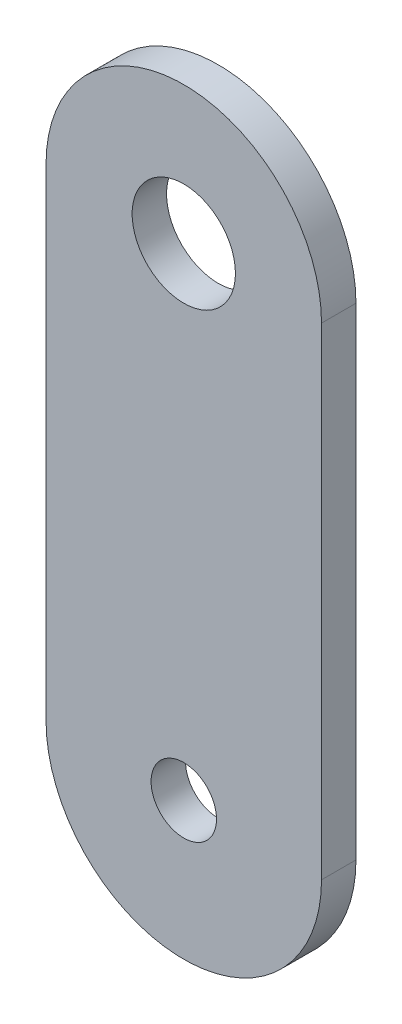
ISO-10303-21;
HEADER;
FILE_DESCRIPTION(('STEP AP214'),'2;1');
FILE_NAME('part.step','',(''),(''),'','','');
FILE_SCHEMA(('AUTOMOTIVE_DESIGN { 1 0 10303 214 1 1 1 1 }'));
ENDSEC;
DATA;
#1=APPLICATION_CONTEXT('core data for automotive mechanical design processes');
#2=APPLICATION_PROTOCOL_DEFINITION('international standard','automotive_design',2000,#1);
#3=PRODUCT_CONTEXT('',#1,'mechanical');
#4=PRODUCT('Part','Part','',(#3));
#5=PRODUCT_RELATED_PRODUCT_CATEGORY('part','',(#4));
#6=PRODUCT_DEFINITION_FORMATION('','',#4);
#7=PRODUCT_DEFINITION_CONTEXT('part definition',#1,'design');
#8=PRODUCT_DEFINITION('design','',#6,#7);
#9=PRODUCT_DEFINITION_SHAPE('','',#8);
#10=(LENGTH_UNIT() NAMED_UNIT(*) SI_UNIT(.MILLI.,.METRE.));
#11=(NAMED_UNIT(*) PLANE_ANGLE_UNIT() SI_UNIT($,.RADIAN.));
#12=(NAMED_UNIT(*) SI_UNIT($,.STERADIAN.) SOLID_ANGLE_UNIT());
#13=UNCERTAINTY_MEASURE_WITH_UNIT(LENGTH_MEASURE(1.E-05),#10,'distance_accuracy_value','');
#14=(GEOMETRIC_REPRESENTATION_CONTEXT(3) GLOBAL_UNCERTAINTY_ASSIGNED_CONTEXT((#13)) GLOBAL_UNIT_ASSIGNED_CONTEXT((#10,
#11,#12)) REPRESENTATION_CONTEXT('',''));
#15=CARTESIAN_POINT('',(0.,0.,0.));
#16=DIRECTION('',(0.,0.,1.));
#17=DIRECTION('',(1.,0.,0.));
#18=AXIS2_PLACEMENT_3D('',#15,#16,#17);
#19=CARTESIAN_POINT('',(0.,-70.,10.));
#20=DIRECTION('',(0.,0.,-1.));
#21=DIRECTION('',(-1.,0.,0.));
#22=AXIS2_PLACEMENT_3D('',#19,#20,#21);
#23=CYLINDRICAL_SURFACE('',#22,40.);
#24=CARTESIAN_POINT('',(0.,-70.,0.));
#25=DIRECTION('',(0.,0.,1.));
#26=DIRECTION('',(1.,0.,0.));
#27=AXIS2_PLACEMENT_3D('',#24,#25,#26);
#28=CIRCLE('',#27,40.);
#29=CARTESIAN_POINT('',(-40.,-70.,0.));
#30=VERTEX_POINT('',#29);
#31=CARTESIAN_POINT('',(40.,-70.,0.));
#32=VERTEX_POINT('',#31);
#33=EDGE_CURVE('E99',#30,#32,#28,.T.);
#34=ORIENTED_EDGE('',*,*,#33,.T.);
#35=DIRECTION('',(0.,0.,-1.));
#36=VECTOR('',#35,1.);
#37=CARTESIAN_POINT('',(40.,-70.,10.));
#38=LINE('',#37,#36);
#39=CARTESIAN_POINT('',(40.,-70.,10.));
#40=VERTEX_POINT('',#39);
#41=EDGE_CURVE('E11',#40,#32,#38,.T.);
#42=ORIENTED_EDGE('',*,*,#41,.F.);
#43=CARTESIAN_POINT('',(0.,-70.,10.));
#44=DIRECTION('',(0.,0.,1.));
#45=DIRECTION('',(1.,0.,0.));
#46=AXIS2_PLACEMENT_3D('',#43,#44,#45);
#47=CIRCLE('',#46,40.);
#48=CARTESIAN_POINT('',(-40.,-70.,10.));
#49=VERTEX_POINT('',#48);
#50=EDGE_CURVE('E87',#49,#40,#47,.T.);
#51=ORIENTED_EDGE('',*,*,#50,.F.);
#52=DIRECTION('',(0.,0.,-1.));
#53=VECTOR('',#52,1.);
#54=CARTESIAN_POINT('',(-40.,-70.,10.));
#55=LINE('',#54,#53);
#56=EDGE_CURVE('E95',#49,#30,#55,.T.);
#57=ORIENTED_EDGE('',*,*,#56,.T.);
#58=EDGE_LOOP('',(#34,#42,#51,#57));
#59=FACE_BOUND('',#58,.T.);
#60=ADVANCED_FACE('F36',(#59),#23,.T.);
#61=CARTESIAN_POINT('',(40.,-70.,10.));
#62=DIRECTION('',(-1.,0.,0.));
#63=DIRECTION('',(0.,-1.,0.));
#64=AXIS2_PLACEMENT_3D('',#61,#62,#63);
#65=PLANE('',#64);
#66=DIRECTION('',(0.,1.,0.));
#67=VECTOR('',#66,1.);
#68=CARTESIAN_POINT('',(40.,-70.,0.));
#69=LINE('',#68,#67);
#70=CARTESIAN_POINT('',(40.,70.,0.));
#71=VERTEX_POINT('',#70);
#72=EDGE_CURVE('E91',#32,#71,#69,.T.);
#73=ORIENTED_EDGE('',*,*,#72,.T.);
#74=DIRECTION('',(0.,0.,-1.));
#75=VECTOR('',#74,1.);
#76=CARTESIAN_POINT('',(40.,70.,10.));
#77=LINE('',#76,#75);
#78=CARTESIAN_POINT('',(40.,70.,10.));
#79=VERTEX_POINT('',#78);
#80=EDGE_CURVE('E44',#79,#71,#77,.T.);
#81=ORIENTED_EDGE('',*,*,#80,.F.);
#82=DIRECTION('',(0.,1.,0.));
#83=VECTOR('',#82,1.);
#84=CARTESIAN_POINT('',(40.,-70.,10.));
#85=LINE('',#84,#83);
#86=EDGE_CURVE('E82',#40,#79,#85,.T.);
#87=ORIENTED_EDGE('',*,*,#86,.F.);
#88=ORIENTED_EDGE('',*,*,#41,.T.);
#89=EDGE_LOOP('',(#73,#81,#87,#88));
#90=FACE_BOUND('',#89,.T.);
#91=ADVANCED_FACE('F90',(#90),#65,.F.);
#92=CARTESIAN_POINT('',(0.,70.,10.));
#93=DIRECTION('',(0.,0.,-1.));
#94=DIRECTION('',(-1.,0.,0.));
#95=AXIS2_PLACEMENT_3D('',#92,#93,#94);
#96=CYLINDRICAL_SURFACE('',#95,40.);
#97=CARTESIAN_POINT('',(0.,70.,0.));
#98=DIRECTION('',(0.,0.,1.));
#99=DIRECTION('',(1.,0.,0.));
#100=AXIS2_PLACEMENT_3D('',#97,#98,#99);
#101=CIRCLE('',#100,40.);
#102=CARTESIAN_POINT('',(-40.,70.,0.));
#103=VERTEX_POINT('',#102);
#104=EDGE_CURVE('E69',#71,#103,#101,.T.);
#105=ORIENTED_EDGE('',*,*,#104,.T.);
#106=DIRECTION('',(0.,0.,-1.));
#107=VECTOR('',#106,1.);
#108=CARTESIAN_POINT('',(-40.,70.,10.));
#109=LINE('',#108,#107);
#110=CARTESIAN_POINT('',(-40.,70.,10.));
#111=VERTEX_POINT('',#110);
#112=EDGE_CURVE('E92',#111,#103,#109,.T.);
#113=ORIENTED_EDGE('',*,*,#112,.F.);
#114=CARTESIAN_POINT('',(0.,70.,10.));
#115=DIRECTION('',(0.,0.,1.));
#116=DIRECTION('',(1.,0.,0.));
#117=AXIS2_PLACEMENT_3D('',#114,#115,#116);
#118=CIRCLE('',#117,40.);
#119=EDGE_CURVE('E85',#79,#111,#118,.T.);
#120=ORIENTED_EDGE('',*,*,#119,.F.);
#121=ORIENTED_EDGE('',*,*,#80,.T.);
#122=EDGE_LOOP('',(#105,#113,#120,#121));
#123=FACE_BOUND('',#122,.T.);
#124=ADVANCED_FACE('F93',(#123),#96,.T.);
#125=CARTESIAN_POINT('',(-40.,-70.,10.));
#126=DIRECTION('',(1.,0.,0.));
#127=DIRECTION('',(0.,1.,0.));
#128=AXIS2_PLACEMENT_3D('',#125,#126,#127);
#129=PLANE('',#128);
#130=DIRECTION('',(0.,-1.,0.));
#131=VECTOR('',#130,1.);
#132=CARTESIAN_POINT('',(-40.,-70.,0.));
#133=LINE('',#132,#131);
#134=EDGE_CURVE('E75',#103,#30,#133,.T.);
#135=ORIENTED_EDGE('',*,*,#134,.T.);
#136=ORIENTED_EDGE('',*,*,#56,.F.);
#137=DIRECTION('',(0.,-1.,0.));
#138=VECTOR('',#137,1.);
#139=CARTESIAN_POINT('',(-40.,-70.,10.));
#140=LINE('',#139,#138);
#141=EDGE_CURVE('E52',#111,#49,#140,.T.);
#142=ORIENTED_EDGE('',*,*,#141,.F.);
#143=ORIENTED_EDGE('',*,*,#112,.T.);
#144=EDGE_LOOP('',(#135,#136,#142,#143));
#145=FACE_BOUND('',#144,.T.);
#146=ADVANCED_FACE('F107',(#145),#129,.F.);
#147=CARTESIAN_POINT('',(0.,-70.,10.));
#148=DIRECTION('',(0.,0.,1.));
#149=DIRECTION('',(1.,0.,0.));
#150=AXIS2_PLACEMENT_3D('',#147,#148,#149);
#151=PLANE('',#150);
#152=CARTESIAN_POINT('',(0.,70.,10.));
#153=DIRECTION('',(0.,0.,1.));
#154=DIRECTION('',(1.,0.,0.));
#155=AXIS2_PLACEMENT_3D('',#152,#153,#154);
#156=CIRCLE('',#155,15.);
#157=CARTESIAN_POINT('',(15.,70.,10.));
#158=VERTEX_POINT('',#157);
#159=EDGE_CURVE('E119',#158,#158,#156,.T.);
#160=ORIENTED_EDGE('',*,*,#159,.F.);
#161=EDGE_LOOP('',(#160));
#162=FACE_BOUND('',#161,.T.);
#163=CARTESIAN_POINT('',(0.,-70.,10.));
#164=DIRECTION('',(0.,0.,1.));
#165=DIRECTION('',(1.,0.,0.));
#166=AXIS2_PLACEMENT_3D('',#163,#164,#165);
#167=CIRCLE('',#166,9.5);
#168=CARTESIAN_POINT('',(9.5,-70.,10.));
#169=VERTEX_POINT('',#168);
#170=EDGE_CURVE('E113',#169,#169,#167,.T.);
#171=ORIENTED_EDGE('',*,*,#170,.F.);
#172=EDGE_LOOP('',(#171));
#173=FACE_BOUND('',#172,.T.);
#174=ORIENTED_EDGE('',*,*,#50,.T.);
#175=ORIENTED_EDGE('',*,*,#86,.T.);
#176=ORIENTED_EDGE('',*,*,#119,.T.);
#177=ORIENTED_EDGE('',*,*,#141,.T.);
#178=EDGE_LOOP('',(#174,#175,#176,#177));
#179=FACE_BOUND('',#178,.T.);
#180=ADVANCED_FACE('F83',(#162,#173,#179),#151,.T.);
#181=CARTESIAN_POINT('',(0.,-70.,0.));
#182=DIRECTION('',(0.,0.,1.));
#183=DIRECTION('',(1.,0.,0.));
#184=AXIS2_PLACEMENT_3D('',#181,#182,#183);
#185=PLANE('',#184);
#186=CARTESIAN_POINT('',(0.,70.,0.));
#187=DIRECTION('',(0.,0.,1.));
#188=DIRECTION('',(1.,0.,0.));
#189=AXIS2_PLACEMENT_3D('',#186,#187,#188);
#190=CIRCLE('',#189,15.);
#191=CARTESIAN_POINT('',(15.,70.,0.));
#192=VERTEX_POINT('',#191);
#193=EDGE_CURVE('E102',#192,#192,#190,.T.);
#194=ORIENTED_EDGE('',*,*,#193,.T.);
#195=EDGE_LOOP('',(#194));
#196=FACE_BOUND('',#195,.T.);
#197=CARTESIAN_POINT('',(0.,-70.,0.));
#198=DIRECTION('',(0.,0.,1.));
#199=DIRECTION('',(1.,0.,0.));
#200=AXIS2_PLACEMENT_3D('',#197,#198,#199);
#201=CIRCLE('',#200,9.5);
#202=CARTESIAN_POINT('',(9.5,-70.,0.));
#203=VERTEX_POINT('',#202);
#204=EDGE_CURVE('E116',#203,#203,#201,.T.);
#205=ORIENTED_EDGE('',*,*,#204,.T.);
#206=EDGE_LOOP('',(#205));
#207=FACE_BOUND('',#206,.T.);
#208=ORIENTED_EDGE('',*,*,#33,.F.);
#209=ORIENTED_EDGE('',*,*,#134,.F.);
#210=ORIENTED_EDGE('',*,*,#104,.F.);
#211=ORIENTED_EDGE('',*,*,#72,.F.);
#212=EDGE_LOOP('',(#208,#209,#210,#211));
#213=FACE_BOUND('',#212,.T.);
#214=ADVANCED_FACE('F110',(#196,#207,#213),#185,.F.);
#215=CARTESIAN_POINT('',(0.,-70.,0.));
#216=DIRECTION('',(0.,0.,1.));
#217=DIRECTION('',(1.,0.,0.));
#218=AXIS2_PLACEMENT_3D('',#215,#216,#217);
#219=CYLINDRICAL_SURFACE('',#218,9.5);
#220=ORIENTED_EDGE('',*,*,#204,.F.);
#221=EDGE_LOOP('',(#220));
#222=FACE_BOUND('',#221,.T.);
#223=ORIENTED_EDGE('',*,*,#170,.T.);
#224=EDGE_LOOP('',(#223));
#225=FACE_BOUND('',#224,.T.);
#226=ADVANCED_FACE('F130',(#222,#225),#219,.F.);
#227=CARTESIAN_POINT('',(0.,70.,0.));
#228=DIRECTION('',(0.,0.,1.));
#229=DIRECTION('',(1.,0.,0.));
#230=AXIS2_PLACEMENT_3D('',#227,#228,#229);
#231=CYLINDRICAL_SURFACE('',#230,15.);
#232=ORIENTED_EDGE('',*,*,#193,.F.);
#233=EDGE_LOOP('',(#232));
#234=FACE_BOUND('',#233,.T.);
#235=ORIENTED_EDGE('',*,*,#159,.T.);
#236=EDGE_LOOP('',(#235));
#237=FACE_BOUND('',#236,.T.);
#238=ADVANCED_FACE('F127',(#234,#237),#231,.F.);
#239=CLOSED_SHELL('',(#60,#91,#124,#146,#180,#214,#226,#238));
#240=MANIFOLD_SOLID_BREP('B2',#239);
#241=ADVANCED_BREP_SHAPE_REPRESENTATION('',(#18,#240),#14);
#242=SHAPE_DEFINITION_REPRESENTATION(#9,#241);
ENDSEC;
END-ISO-10303-21;
